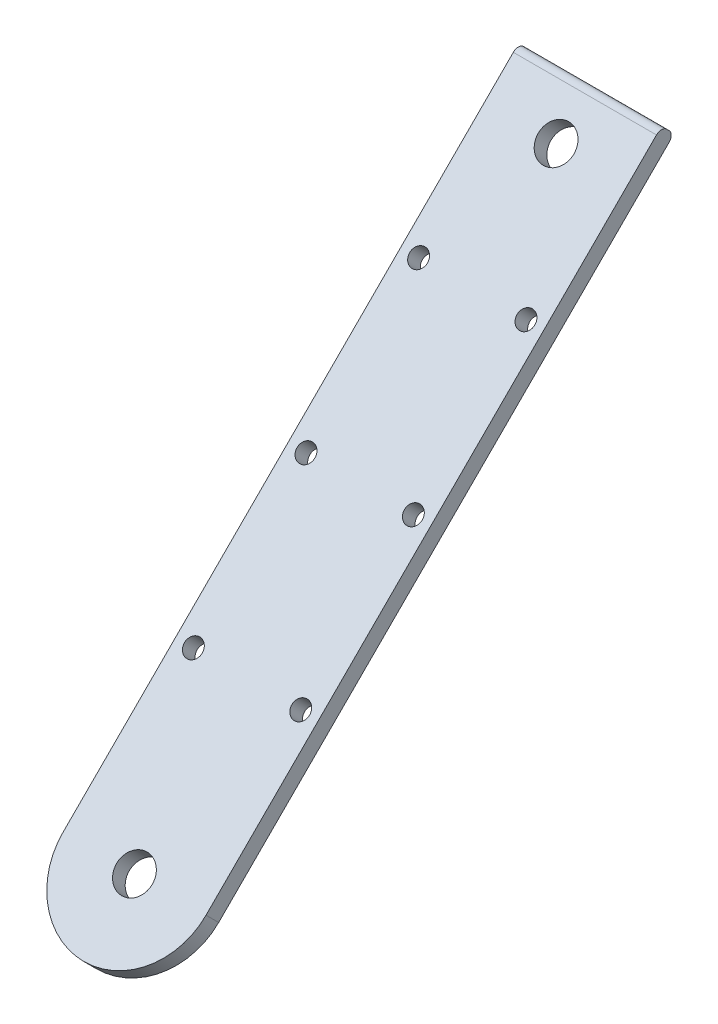
ISO-10303-21;
HEADER;
FILE_DESCRIPTION(('STEP AP214'),'2;1');
FILE_NAME('part.step','',(''),(''),'','','');
FILE_SCHEMA(('AUTOMOTIVE_DESIGN { 1 0 10303 214 1 1 1 1 }'));
ENDSEC;
DATA;
#1=APPLICATION_CONTEXT('core data for automotive mechanical design processes');
#2=APPLICATION_PROTOCOL_DEFINITION('international standard','automotive_design',2000,#1);
#3=PRODUCT_CONTEXT('',#1,'mechanical');
#4=PRODUCT('Part','Part','',(#3));
#5=PRODUCT_RELATED_PRODUCT_CATEGORY('part','',(#4));
#6=PRODUCT_DEFINITION_FORMATION('','',#4);
#7=PRODUCT_DEFINITION_CONTEXT('part definition',#1,'design');
#8=PRODUCT_DEFINITION('design','',#6,#7);
#9=PRODUCT_DEFINITION_SHAPE('','',#8);
#10=(LENGTH_UNIT() NAMED_UNIT(*) SI_UNIT(.MILLI.,.METRE.));
#11=(NAMED_UNIT(*) PLANE_ANGLE_UNIT() SI_UNIT($,.RADIAN.));
#12=(NAMED_UNIT(*) SI_UNIT($,.STERADIAN.) SOLID_ANGLE_UNIT());
#13=UNCERTAINTY_MEASURE_WITH_UNIT(LENGTH_MEASURE(1.E-05),#10,'distance_accuracy_value','');
#14=(GEOMETRIC_REPRESENTATION_CONTEXT(3) GLOBAL_UNCERTAINTY_ASSIGNED_CONTEXT((#13)) GLOBAL_UNIT_ASSIGNED_CONTEXT((#10,
#11,#12)) REPRESENTATION_CONTEXT('',''));
#15=CARTESIAN_POINT('',(0.,0.,0.));
#16=DIRECTION('',(0.,0.,1.));
#17=DIRECTION('',(1.,0.,0.));
#18=AXIS2_PLACEMENT_3D('',#15,#16,#17);
#19=CARTESIAN_POINT('',(40.,125.460804134923,-79.9944564252471));
#20=DIRECTION('',(-1.,0.,0.));
#21=DIRECTION('',(0.,0.,1.));
#22=AXIS2_PLACEMENT_3D('',#19,#20,#21);
#23=CYLINDRICAL_SURFACE('',#22,2.);
#24=CARTESIAN_POINT('',(0.,125.460804134923,-79.9944564252471));
#25=DIRECTION('',(1.,0.,0.));
#26=DIRECTION('',(0.,0.,-1.));
#27=AXIS2_PLACEMENT_3D('',#24,#25,#26);
#28=CIRCLE('',#27,2.);
#29=CARTESIAN_POINT('',(0.,126.875017697296,-81.4086699876202));
#30=VERTEX_POINT('',#29);
#31=CARTESIAN_POINT('',(0.,124.04659057255,-81.4086699876202));
#32=VERTEX_POINT('',#31);
#33=EDGE_CURVE('E107',#30,#32,#28,.F.);
#34=ORIENTED_EDGE('',*,*,#33,.F.);
#35=DIRECTION('',(-1.,0.,0.));
#36=VECTOR('',#35,1.);
#37=CARTESIAN_POINT('',(40.,126.875017697296,-81.4086699876202));
#38=LINE('',#37,#36);
#39=CARTESIAN_POINT('',(40.,126.875017697296,-81.4086699876202));
#40=VERTEX_POINT('',#39);
#41=EDGE_CURVE('E101',#40,#30,#38,.T.);
#42=ORIENTED_EDGE('',*,*,#41,.F.);
#43=CARTESIAN_POINT('',(40.,125.460804134923,-79.9944564252471));
#44=DIRECTION('',(1.,0.,0.));
#45=DIRECTION('',(0.,0.,-1.));
#46=AXIS2_PLACEMENT_3D('',#43,#44,#45);
#47=CIRCLE('',#46,2.);
#48=CARTESIAN_POINT('',(40.,124.04659057255,-81.4086699876202));
#49=VERTEX_POINT('',#48);
#50=EDGE_CURVE('E104',#40,#49,#47,.F.);
#51=ORIENTED_EDGE('',*,*,#50,.T.);
#52=DIRECTION('',(-1.,0.,0.));
#53=VECTOR('',#52,1.);
#54=CARTESIAN_POINT('',(40.,124.04659057255,-81.4086699876202));
#55=LINE('',#54,#53);
#56=EDGE_CURVE('E145',#49,#32,#55,.T.);
#57=ORIENTED_EDGE('',*,*,#56,.T.);
#58=EDGE_LOOP('',(#34,#42,#51,#57));
#59=FACE_BOUND('',#58,.T.);
#60=ADVANCED_FACE('F40',(#59),#23,.T.);
#61=CARTESIAN_POINT('',(40.,104.141843842459,-104.141843842457));
#62=DIRECTION('',(0.,-0.707106781186554,0.707106781186541));
#63=DIRECTION('',(0.,-0.707106781186541,-0.707106781186554));
#64=AXIS2_PLACEMENT_3D('',#61,#62,#63);
#65=PLANE('',#64);
#66=DIRECTION('',(0.,0.707106781186541,0.707106781186554));
#67=VECTOR('',#66,1.);
#68=CARTESIAN_POINT('',(0.,104.141843842459,-104.141843842457));
#69=LINE('',#68,#67);
#70=CARTESIAN_POINT('',(0.,127.579811131654,-80.7038765532618));
#71=VERTEX_POINT('',#70);
#72=EDGE_CURVE('E148',#30,#71,#69,.T.);
#73=ORIENTED_EDGE('',*,*,#72,.T.);
#74=DIRECTION('',(-1.,0.,0.));
#75=VECTOR('',#74,1.);
#76=CARTESIAN_POINT('',(40.,127.579811131654,-80.7038765532618));
#77=LINE('',#76,#75);
#78=CARTESIAN_POINT('',(40.,127.579811131654,-80.7038765532618));
#79=VERTEX_POINT('',#78);
#80=EDGE_CURVE('E112',#79,#71,#77,.T.);
#81=ORIENTED_EDGE('',*,*,#80,.F.);
#82=DIRECTION('',(0.,0.707106781186541,0.707106781186554));
#83=VECTOR('',#82,1.);
#84=CARTESIAN_POINT('',(40.,104.141843842459,-104.141843842457));
#85=LINE('',#84,#83);
#86=EDGE_CURVE('E115',#40,#79,#85,.T.);
#87=ORIENTED_EDGE('',*,*,#86,.F.);
#88=ORIENTED_EDGE('',*,*,#41,.T.);
#89=EDGE_LOOP('',(#73,#81,#87,#88));
#90=FACE_BOUND('',#89,.T.);
#91=ADVANCED_FACE('F116',(#90),#65,.F.);
#92=CARTESIAN_POINT('',(40.,126.165597569281,-79.2896629908887));
#93=DIRECTION('',(-1.,0.,0.));
#94=DIRECTION('',(0.,0.,1.));
#95=AXIS2_PLACEMENT_3D('',#92,#93,#94);
#96=CYLINDRICAL_SURFACE('',#95,1.99999999999998);
#97=CARTESIAN_POINT('',(0.,126.165597569281,-79.2896629908887));
#98=DIRECTION('',(1.,0.,0.));
#99=DIRECTION('',(0.,0.,-1.));
#100=AXIS2_PLACEMENT_3D('',#97,#98,#99);
#101=CIRCLE('',#100,1.99999999999998);
#102=CARTESIAN_POINT('',(0.,127.579811131654,-77.8754494285156));
#103=VERTEX_POINT('',#102);
#104=EDGE_CURVE('E151',#71,#103,#101,.T.);
#105=ORIENTED_EDGE('',*,*,#104,.T.);
#106=DIRECTION('',(-1.,0.,0.));
#107=VECTOR('',#106,1.);
#108=CARTESIAN_POINT('',(40.,127.579811131654,-77.8754494285156));
#109=LINE('',#108,#107);
#110=CARTESIAN_POINT('',(40.,127.579811131654,-77.8754494285156));
#111=VERTEX_POINT('',#110);
#112=EDGE_CURVE('E159',#111,#103,#109,.T.);
#113=ORIENTED_EDGE('',*,*,#112,.F.);
#114=CARTESIAN_POINT('',(40.,126.165597569281,-79.2896629908887));
#115=DIRECTION('',(1.,0.,0.));
#116=DIRECTION('',(0.,0.,-1.));
#117=AXIS2_PLACEMENT_3D('',#114,#115,#116);
#118=CIRCLE('',#117,1.99999999999998);
#119=EDGE_CURVE('E122',#79,#111,#118,.T.);
#120=ORIENTED_EDGE('',*,*,#119,.F.);
#121=ORIENTED_EDGE('',*,*,#80,.T.);
#122=EDGE_LOOP('',(#105,#113,#120,#121));
#123=FACE_BOUND('',#122,.T.);
#124=ADVANCED_FACE('F242',(#123),#96,.T.);
#125=CARTESIAN_POINT('',(40.,24.8521808515692,24.8521808515693));
#126=DIRECTION('',(0.,0.707106781186546,0.707106781186549));
#127=DIRECTION('',(0.,-0.707106781186549,0.707106781186546));
#128=AXIS2_PLACEMENT_3D('',#125,#126,#127);
#129=PLANE('',#128);
#130=CARTESIAN_POINT('',(20.,119.525790268548,-69.8214285654092));
#131=DIRECTION('',(0.,0.707106781186546,0.707106781186549));
#132=DIRECTION('',(0.,-0.707106781186549,0.707106781186546));
#133=AXIS2_PLACEMENT_3D('',#130,#131,#132);
#134=CIRCLE('',#133,5.);
#135=CARTESIAN_POINT('',(20.,115.990256362615,-66.2858946594765));
#136=VERTEX_POINT('',#135);
#137=EDGE_CURVE('E301',#136,#136,#134,.T.);
#138=ORIENTED_EDGE('',*,*,#137,.F.);
#139=EDGE_LOOP('',(#138));
#140=FACE_BOUND('',#139,.T.);
#141=CARTESIAN_POINT('',(20.,1.71480408044884,47.9895576226897));
#142=DIRECTION('',(0.,0.707106781186546,0.707106781186549));
#143=DIRECTION('',(0.,-0.707106781186549,0.707106781186546));
#144=AXIS2_PLACEMENT_3D('',#141,#142,#143);
#145=CIRCLE('',#144,5.);
#146=CARTESIAN_POINT('',(20.,-1.8207298254839,51.5250915286224));
#147=VERTEX_POINT('',#146);
#148=EDGE_CURVE('E186',#147,#147,#145,.T.);
#149=ORIENTED_EDGE('',*,*,#148,.F.);
#150=EDGE_LOOP('',(#149));
#151=FACE_BOUND('',#150,.T.);
#152=CARTESIAN_POINT('',(4.99999999999999,96.1135593688531,-46.4091976657143));
#153=DIRECTION('',(0.,0.707106781186546,0.707106781186549));
#154=DIRECTION('',(0.,0.707106781186549,-0.707106781186546));
#155=AXIS2_PLACEMENT_3D('',#152,#153,#154);
#156=CIRCLE('',#155,2.5);
#157=CARTESIAN_POINT('',(4.99999999999999,97.8813263218194,-48.1769646186806));
#158=VERTEX_POINT('',#157);
#159=EDGE_CURVE('E308',#158,#158,#156,.T.);
#160=ORIENTED_EDGE('',*,*,#159,.F.);
#161=EDGE_LOOP('',(#160));
#162=FACE_BOUND('',#161,.T.);
#163=CARTESIAN_POINT('',(4.99999999999999,64.6473076060517,-14.942945902913));
#164=DIRECTION('',(0.,0.707106781186546,0.707106781186549));
#165=DIRECTION('',(0.,0.707106781186549,-0.707106781186546));
#166=AXIS2_PLACEMENT_3D('',#163,#164,#165);
#167=CIRCLE('',#166,2.5);
#168=CARTESIAN_POINT('',(4.99999999999999,66.415074559018,-16.7107128558793));
#169=VERTEX_POINT('',#168);
#170=EDGE_CURVE('E315',#169,#169,#167,.T.);
#171=ORIENTED_EDGE('',*,*,#170,.F.);
#172=EDGE_LOOP('',(#171));
#173=FACE_BOUND('',#172,.T.);
#174=CARTESIAN_POINT('',(4.99999999999999,33.1810558432502,16.5233058598884));
#175=DIRECTION('',(0.,0.707106781186546,0.707106781186549));
#176=DIRECTION('',(0.,0.707106781186549,-0.707106781186546));
#177=AXIS2_PLACEMENT_3D('',#174,#175,#176);
#178=CIRCLE('',#177,2.5);
#179=CARTESIAN_POINT('',(4.99999999999999,34.9488227962166,14.755538906922));
#180=VERTEX_POINT('',#179);
#181=EDGE_CURVE('E135',#180,#180,#178,.T.);
#182=ORIENTED_EDGE('',*,*,#181,.F.);
#183=EDGE_LOOP('',(#182));
#184=FACE_BOUND('',#183,.T.);
#185=CARTESIAN_POINT('',(35.,33.1810558432502,16.5233058598884));
#186=DIRECTION('',(0.,0.707106781186546,0.707106781186549));
#187=DIRECTION('',(0.,-0.707106781186549,0.707106781186546));
#188=AXIS2_PLACEMENT_3D('',#185,#186,#187);
#189=CIRCLE('',#188,2.5);
#190=CARTESIAN_POINT('',(35.,31.4132888902839,18.2910728128547));
#191=VERTEX_POINT('',#190);
#192=EDGE_CURVE('E328',#191,#191,#189,.T.);
#193=ORIENTED_EDGE('',*,*,#192,.F.);
#194=EDGE_LOOP('',(#193));
#195=FACE_BOUND('',#194,.T.);
#196=CARTESIAN_POINT('',(35.,64.6473076060517,-14.942945902913));
#197=DIRECTION('',(0.,0.707106781186546,0.707106781186549));
#198=DIRECTION('',(0.,-0.707106781186549,0.707106781186546));
#199=AXIS2_PLACEMENT_3D('',#196,#197,#198);
#200=CIRCLE('',#199,2.5);
#201=CARTESIAN_POINT('',(35.,62.8795406530853,-13.1751789499466));
#202=VERTEX_POINT('',#201);
#203=EDGE_CURVE('E325',#202,#202,#200,.T.);
#204=ORIENTED_EDGE('',*,*,#203,.F.);
#205=EDGE_LOOP('',(#204));
#206=FACE_BOUND('',#205,.T.);
#207=CARTESIAN_POINT('',(35.,96.1135593688531,-46.4091976657143));
#208=DIRECTION('',(0.,0.707106781186546,0.707106781186549));
#209=DIRECTION('',(0.,-0.707106781186549,0.707106781186546));
#210=AXIS2_PLACEMENT_3D('',#207,#208,#209);
#211=CIRCLE('',#210,2.5);
#212=CARTESIAN_POINT('',(35.,94.3457924158867,-44.6414307127479));
#213=VERTEX_POINT('',#212);
#214=EDGE_CURVE('E314',#213,#213,#211,.T.);
#215=ORIENTED_EDGE('',*,*,#214,.F.);
#216=EDGE_LOOP('',(#215));
#217=FACE_BOUND('',#216,.T.);
#218=DIRECTION('',(0.,0.707106781186549,-0.707106781186546));
#219=VECTOR('',#218,1.);
#220=CARTESIAN_POINT('',(0.,24.8521808515692,24.8521808515693));
#221=LINE('',#220,#219);
#222=CARTESIAN_POINT('',(0.,1.71480408044882,47.9895576226897));
#223=VERTEX_POINT('',#222);
#224=EDGE_CURVE('E132',#223,#103,#221,.T.);
#225=ORIENTED_EDGE('',*,*,#224,.F.);
#226=CARTESIAN_POINT('',(20.,1.71480408044883,47.9895576226897));
#227=DIRECTION('',(0.,0.707106781186546,0.707106781186549));
#228=DIRECTION('',(0.,-0.707106781186549,0.707106781186546));
#229=AXIS2_PLACEMENT_3D('',#226,#227,#228);
#230=CIRCLE('',#229,20.);
#231=CARTESIAN_POINT('',(20.,-12.4273315432822,62.1316932464206));
#232=VERTEX_POINT('',#231);
#233=EDGE_CURVE('E50',#223,#232,#230,.T.);
#234=ORIENTED_EDGE('',*,*,#233,.T.);
#235=CARTESIAN_POINT('',(20.,1.71480408044882,47.9895576226897));
#236=DIRECTION('',(0.,0.707106781186546,0.707106781186549));
#237=DIRECTION('',(0.,-0.707106781186549,0.707106781186546));
#238=AXIS2_PLACEMENT_3D('',#235,#236,#237);
#239=CIRCLE('',#238,20.);
#240=CARTESIAN_POINT('',(40.,1.71480408044882,47.9895576226897));
#241=VERTEX_POINT('',#240);
#242=EDGE_CURVE('E167',#232,#241,#239,.T.);
#243=ORIENTED_EDGE('',*,*,#242,.T.);
#244=DIRECTION('',(0.,0.707106781186549,-0.707106781186546));
#245=VECTOR('',#244,1.);
#246=CARTESIAN_POINT('',(40.,24.8521808515692,24.8521808515693));
#247=LINE('',#246,#245);
#248=EDGE_CURVE('E140',#241,#111,#247,.T.);
#249=ORIENTED_EDGE('',*,*,#248,.T.);
#250=ORIENTED_EDGE('',*,*,#112,.T.);
#251=EDGE_LOOP('',(#225,#234,#243,#249,#250));
#252=FACE_BOUND('',#251,.T.);
#253=ADVANCED_FACE('F216',(#140,#151,#162,#173,#184,#195,#206,#217,#252),#129,.T.);
#254=CARTESIAN_POINT('',(40.,21.3189602924649,21.3189602924652));
#255=DIRECTION('',(0.,-0.707106781186543,-0.707106781186552));
#256=DIRECTION('',(0.,0.707106781186552,-0.707106781186543));
#257=AXIS2_PLACEMENT_3D('',#254,#255,#256);
#258=PLANE('',#257);
#259=CARTESIAN_POINT('',(20.,115.992569709444,-73.354649124513));
#260=DIRECTION('',(0.,-0.707106781186543,-0.707106781186552));
#261=DIRECTION('',(0.,0.707106781186552,-0.707106781186543));
#262=AXIS2_PLACEMENT_3D('',#259,#260,#261);
#263=CIRCLE('',#262,5.);
#264=CARTESIAN_POINT('',(20.,119.528103615377,-76.8901830304457));
#265=VERTEX_POINT('',#264);
#266=EDGE_CURVE('E304',#265,#265,#263,.T.);
#267=ORIENTED_EDGE('',*,*,#266,.F.);
#268=EDGE_LOOP('',(#267));
#269=FACE_BOUND('',#268,.T.);
#270=CARTESIAN_POINT('',(20.,-1.81841647865548,44.4563370635853));
#271=DIRECTION('',(0.,-0.707106781186543,-0.707106781186552));
#272=DIRECTION('',(0.,0.707106781186552,-0.707106781186543));
#273=AXIS2_PLACEMENT_3D('',#270,#271,#272);
#274=CIRCLE('',#273,5.);
#275=CARTESIAN_POINT('',(20.,1.71711742727728,40.9208031576526));
#276=VERTEX_POINT('',#275);
#277=EDGE_CURVE('E44',#276,#276,#274,.T.);
#278=ORIENTED_EDGE('',*,*,#277,.F.);
#279=EDGE_LOOP('',(#278));
#280=FACE_BOUND('',#279,.T.);
#281=CARTESIAN_POINT('',(4.99999999999999,92.5803388097492,-49.9424182248182));
#282=DIRECTION('',(0.,-0.707106781186543,-0.707106781186552));
#283=DIRECTION('',(0.,0.707106781186552,-0.707106781186543));
#284=AXIS2_PLACEMENT_3D('',#281,#282,#283);
#285=CIRCLE('',#284,2.5);
#286=CARTESIAN_POINT('',(4.99999999999999,94.3481057627155,-51.7101851777845));
#287=VERTEX_POINT('',#286);
#288=EDGE_CURVE('E201',#287,#287,#285,.T.);
#289=ORIENTED_EDGE('',*,*,#288,.F.);
#290=EDGE_LOOP('',(#289));
#291=FACE_BOUND('',#290,.T.);
#292=CARTESIAN_POINT('',(4.99999999999999,61.1140870469476,-18.476166462017));
#293=DIRECTION('',(0.,-0.707106781186543,-0.707106781186552));
#294=DIRECTION('',(0.,0.707106781186552,-0.707106781186543));
#295=AXIS2_PLACEMENT_3D('',#292,#293,#294);
#296=CIRCLE('',#295,2.5);
#297=CARTESIAN_POINT('',(4.99999999999999,62.881853999914,-20.2439334149834));
#298=VERTEX_POINT('',#297);
#299=EDGE_CURVE('E198',#298,#298,#296,.T.);
#300=ORIENTED_EDGE('',*,*,#299,.F.);
#301=EDGE_LOOP('',(#300));
#302=FACE_BOUND('',#301,.T.);
#303=CARTESIAN_POINT('',(4.99999999999999,29.6478352841461,12.9900853007842));
#304=DIRECTION('',(0.,-0.707106781186543,-0.707106781186552));
#305=DIRECTION('',(0.,0.707106781186552,-0.707106781186543));
#306=AXIS2_PLACEMENT_3D('',#303,#304,#305);
#307=CIRCLE('',#306,2.5);
#308=CARTESIAN_POINT('',(4.99999999999999,31.4156022371125,11.2223183478178));
#309=VERTEX_POINT('',#308);
#310=EDGE_CURVE('E194',#309,#309,#307,.T.);
#311=ORIENTED_EDGE('',*,*,#310,.F.);
#312=EDGE_LOOP('',(#311));
#313=FACE_BOUND('',#312,.T.);
#314=CARTESIAN_POINT('',(35.,29.6478352841461,12.9900853007842));
#315=DIRECTION('',(0.,-0.707106781186543,-0.707106781186552));
#316=DIRECTION('',(0.,0.707106781186552,-0.707106781186543));
#317=AXIS2_PLACEMENT_3D('',#314,#315,#316);
#318=CIRCLE('',#317,2.5);
#319=CARTESIAN_POINT('',(35.,31.4156022371125,11.2223183478178));
#320=VERTEX_POINT('',#319);
#321=EDGE_CURVE('E190',#320,#320,#318,.T.);
#322=ORIENTED_EDGE('',*,*,#321,.F.);
#323=EDGE_LOOP('',(#322));
#324=FACE_BOUND('',#323,.T.);
#325=CARTESIAN_POINT('',(35.,61.1140870469476,-18.476166462017));
#326=DIRECTION('',(0.,-0.707106781186543,-0.707106781186552));
#327=DIRECTION('',(0.,0.707106781186552,-0.707106781186543));
#328=AXIS2_PLACEMENT_3D('',#325,#326,#327);
#329=CIRCLE('',#328,2.5);
#330=CARTESIAN_POINT('',(35.,62.881853999914,-20.2439334149834));
#331=VERTEX_POINT('',#330);
#332=EDGE_CURVE('E185',#331,#331,#329,.T.);
#333=ORIENTED_EDGE('',*,*,#332,.F.);
#334=EDGE_LOOP('',(#333));
#335=FACE_BOUND('',#334,.T.);
#336=CARTESIAN_POINT('',(35.,92.5803388097492,-49.9424182248182));
#337=DIRECTION('',(0.,-0.707106781186543,-0.707106781186552));
#338=DIRECTION('',(0.,0.707106781186552,-0.707106781186543));
#339=AXIS2_PLACEMENT_3D('',#336,#337,#338);
#340=CIRCLE('',#339,2.5);
#341=CARTESIAN_POINT('',(35.,94.3481057627155,-51.7101851777845));
#342=VERTEX_POINT('',#341);
#343=EDGE_CURVE('E181',#342,#342,#340,.T.);
#344=ORIENTED_EDGE('',*,*,#343,.F.);
#345=EDGE_LOOP('',(#344));
#346=FACE_BOUND('',#345,.T.);
#347=CARTESIAN_POINT('',(20.,-1.81841647865547,44.4563370635853));
#348=DIRECTION('',(0.,-0.707106781186543,-0.707106781186552));
#349=DIRECTION('',(0.,0.707106781186552,-0.707106781186543));
#350=AXIS2_PLACEMENT_3D('',#347,#348,#349);
#351=CIRCLE('',#350,20.);
#352=CARTESIAN_POINT('',(40.,-1.81841647865547,44.4563370635853));
#353=VERTEX_POINT('',#352);
#354=CARTESIAN_POINT('',(20.,-15.9605521023865,58.5984726873162));
#355=VERTEX_POINT('',#354);
#356=EDGE_CURVE('E173',#353,#355,#351,.T.);
#357=ORIENTED_EDGE('',*,*,#356,.T.);
#358=CARTESIAN_POINT('',(20.,-1.81841647865546,44.4563370635853));
#359=DIRECTION('',(0.,-0.707106781186543,-0.707106781186552));
#360=DIRECTION('',(0.,0.707106781186552,-0.707106781186543));
#361=AXIS2_PLACEMENT_3D('',#358,#359,#360);
#362=CIRCLE('',#361,20.);
#363=CARTESIAN_POINT('',(0.,-1.81841647865546,44.4563370635853));
#364=VERTEX_POINT('',#363);
#365=EDGE_CURVE('E11',#355,#364,#362,.T.);
#366=ORIENTED_EDGE('',*,*,#365,.T.);
#367=DIRECTION('',(0.,-0.707106781186552,0.707106781186543));
#368=VECTOR('',#367,1.);
#369=CARTESIAN_POINT('',(0.,21.3189602924649,21.3189602924652));
#370=LINE('',#369,#368);
#371=EDGE_CURVE('E129',#32,#364,#370,.T.);
#372=ORIENTED_EDGE('',*,*,#371,.F.);
#373=ORIENTED_EDGE('',*,*,#56,.F.);
#374=DIRECTION('',(0.,-0.707106781186552,0.707106781186543));
#375=VECTOR('',#374,1.);
#376=CARTESIAN_POINT('',(40.,21.3189602924649,21.3189602924652));
#377=LINE('',#376,#375);
#378=EDGE_CURVE('E127',#49,#353,#377,.T.);
#379=ORIENTED_EDGE('',*,*,#378,.T.);
#380=EDGE_LOOP('',(#357,#366,#372,#373,#379));
#381=FACE_BOUND('',#380,.T.);
#382=ADVANCED_FACE('F213',(#269,#280,#291,#302,#313,#324,#335,#346,#381),#258,.T.);
#383=CARTESIAN_POINT('',(40.,0.,0.));
#384=DIRECTION('',(1.,0.,0.));
#385=DIRECTION('',(0.,0.,-1.));
#386=AXIS2_PLACEMENT_3D('',#383,#384,#385);
#387=PLANE('',#386);
#388=ORIENTED_EDGE('',*,*,#248,.F.);
#389=DIRECTION('',(0.,0.707106781186544,0.707106781186551));
#390=VECTOR('',#389,1.);
#391=CARTESIAN_POINT('',(40.,-23.1373767711204,23.1373767711202));
#392=LINE('',#391,#390);
#393=EDGE_CURVE('E170',#241,#353,#392,.F.);
#394=ORIENTED_EDGE('',*,*,#393,.T.);
#395=ORIENTED_EDGE('',*,*,#378,.F.);
#396=ORIENTED_EDGE('',*,*,#50,.F.);
#397=ORIENTED_EDGE('',*,*,#86,.T.);
#398=ORIENTED_EDGE('',*,*,#119,.T.);
#399=EDGE_LOOP('',(#388,#394,#395,#396,#397,#398));
#400=FACE_BOUND('',#399,.T.);
#401=ADVANCED_FACE('F125',(#400),#387,.T.);
#402=CARTESIAN_POINT('',(0.,0.,0.));
#403=DIRECTION('',(1.,0.,0.));
#404=DIRECTION('',(0.,0.,-1.));
#405=AXIS2_PLACEMENT_3D('',#402,#403,#404);
#406=PLANE('',#405);
#407=ORIENTED_EDGE('',*,*,#371,.T.);
#408=DIRECTION('',(0.,0.707106781186544,0.707106781186551));
#409=VECTOR('',#408,1.);
#410=CARTESIAN_POINT('',(0.,1.71480408044886,47.9895576226897));
#411=LINE('',#410,#409);
#412=EDGE_CURVE('E176',#364,#223,#411,.T.);
#413=ORIENTED_EDGE('',*,*,#412,.T.);
#414=ORIENTED_EDGE('',*,*,#224,.T.);
#415=ORIENTED_EDGE('',*,*,#104,.F.);
#416=ORIENTED_EDGE('',*,*,#72,.F.);
#417=ORIENTED_EDGE('',*,*,#33,.T.);
#418=EDGE_LOOP('',(#407,#413,#414,#415,#416,#417));
#419=FACE_BOUND('',#418,.T.);
#420=ADVANCED_FACE('F237',(#419),#406,.F.);
#421=CARTESIAN_POINT('',(20.,-23.1373767711204,23.1373767711202));
#422=DIRECTION('',(0.,0.707106781186544,0.707106781186551));
#423=DIRECTION('',(0.,-0.707106781186551,0.707106781186544));
#424=AXIS2_PLACEMENT_3D('',#421,#422,#423);
#425=CYLINDRICAL_SURFACE('',#424,20.);
#426=ORIENTED_EDGE('',*,*,#356,.F.);
#427=ORIENTED_EDGE('',*,*,#393,.F.);
#428=ORIENTED_EDGE('',*,*,#242,.F.);
#429=DIRECTION('',(0.,0.707106781186544,0.707106781186551));
#430=VECTOR('',#429,1.);
#431=CARTESIAN_POINT('',(20.,-37.2795123948514,37.279512394851));
#432=LINE('',#431,#430);
#433=EDGE_CURVE('E111',#355,#232,#432,.T.);
#434=ORIENTED_EDGE('',*,*,#433,.F.);
#435=EDGE_LOOP('',(#426,#427,#428,#434));
#436=FACE_BOUND('',#435,.T.);
#437=ADVANCED_FACE('F234',(#436),#425,.T.);
#438=CARTESIAN_POINT('',(20.,-23.1373767711204,23.1373767711202));
#439=DIRECTION('',(0.,-0.707106781186544,-0.707106781186551));
#440=DIRECTION('',(0.,0.707106781186551,-0.707106781186544));
#441=AXIS2_PLACEMENT_3D('',#438,#439,#440);
#442=CYLINDRICAL_SURFACE('',#441,20.);
#443=ORIENTED_EDGE('',*,*,#365,.F.);
#444=ORIENTED_EDGE('',*,*,#433,.T.);
#445=ORIENTED_EDGE('',*,*,#233,.F.);
#446=ORIENTED_EDGE('',*,*,#412,.F.);
#447=EDGE_LOOP('',(#443,#444,#445,#446));
#448=FACE_BOUND('',#447,.T.);
#449=ADVANCED_FACE('F42',(#448),#442,.T.);
#450=CARTESIAN_POINT('',(35.,92.5780254629203,-49.944731571647));
#451=DIRECTION('',(0.,0.707106781186546,0.707106781186549));
#452=DIRECTION('',(0.,-0.707106781186549,0.707106781186546));
#453=AXIS2_PLACEMENT_3D('',#450,#451,#452);
#454=CYLINDRICAL_SURFACE('',#453,2.5);
#455=ORIENTED_EDGE('',*,*,#343,.T.);
#456=EDGE_LOOP('',(#455));
#457=FACE_BOUND('',#456,.T.);
#458=ORIENTED_EDGE('',*,*,#214,.T.);
#459=EDGE_LOOP('',(#458));
#460=FACE_BOUND('',#459,.T.);
#461=ADVANCED_FACE('F262',(#457,#460),#454,.F.);
#462=CARTESIAN_POINT('',(35.,61.1117737001189,-18.4784798088457));
#463=DIRECTION('',(0.,0.707106781186546,0.707106781186549));
#464=DIRECTION('',(0.,-0.707106781186549,0.707106781186546));
#465=AXIS2_PLACEMENT_3D('',#462,#463,#464);
#466=CYLINDRICAL_SURFACE('',#465,2.5);
#467=ORIENTED_EDGE('',*,*,#332,.T.);
#468=EDGE_LOOP('',(#467));
#469=FACE_BOUND('',#468,.T.);
#470=ORIENTED_EDGE('',*,*,#203,.T.);
#471=EDGE_LOOP('',(#470));
#472=FACE_BOUND('',#471,.T.);
#473=ADVANCED_FACE('F277',(#469,#472),#466,.F.);
#474=CARTESIAN_POINT('',(35.,29.6455219373175,12.9877719539556));
#475=DIRECTION('',(0.,0.707106781186546,0.707106781186549));
#476=DIRECTION('',(0.,-0.707106781186549,0.707106781186546));
#477=AXIS2_PLACEMENT_3D('',#474,#475,#476);
#478=CYLINDRICAL_SURFACE('',#477,2.5);
#479=ORIENTED_EDGE('',*,*,#321,.T.);
#480=EDGE_LOOP('',(#479));
#481=FACE_BOUND('',#480,.T.);
#482=ORIENTED_EDGE('',*,*,#192,.T.);
#483=EDGE_LOOP('',(#482));
#484=FACE_BOUND('',#483,.T.);
#485=ADVANCED_FACE('F273',(#481,#484),#478,.F.);
#486=CARTESIAN_POINT('',(4.99999999999999,29.6455219373175,12.9877719539556));
#487=DIRECTION('',(0.,0.707106781186546,0.707106781186549));
#488=DIRECTION('',(0.,-0.707106781186549,0.707106781186546));
#489=AXIS2_PLACEMENT_3D('',#486,#487,#488);
#490=CYLINDRICAL_SURFACE('',#489,2.5);
#491=ORIENTED_EDGE('',*,*,#310,.T.);
#492=EDGE_LOOP('',(#491));
#493=FACE_BOUND('',#492,.T.);
#494=ORIENTED_EDGE('',*,*,#181,.T.);
#495=EDGE_LOOP('',(#494));
#496=FACE_BOUND('',#495,.T.);
#497=ADVANCED_FACE('F269',(#493,#496),#490,.F.);
#498=CARTESIAN_POINT('',(4.99999999999999,61.1117737001189,-18.4784798088457));
#499=DIRECTION('',(0.,0.707106781186546,0.707106781186549));
#500=DIRECTION('',(0.,-0.707106781186549,0.707106781186546));
#501=AXIS2_PLACEMENT_3D('',#498,#499,#500);
#502=CYLINDRICAL_SURFACE('',#501,2.5);
#503=ORIENTED_EDGE('',*,*,#299,.T.);
#504=EDGE_LOOP('',(#503));
#505=FACE_BOUND('',#504,.T.);
#506=ORIENTED_EDGE('',*,*,#170,.T.);
#507=EDGE_LOOP('',(#506));
#508=FACE_BOUND('',#507,.T.);
#509=ADVANCED_FACE('F272',(#505,#508),#502,.F.);
#510=CARTESIAN_POINT('',(4.99999999999999,92.5780254629203,-49.944731571647));
#511=DIRECTION('',(0.,0.707106781186546,0.707106781186549));
#512=DIRECTION('',(0.,-0.707106781186549,0.707106781186546));
#513=AXIS2_PLACEMENT_3D('',#510,#511,#512);
#514=CYLINDRICAL_SURFACE('',#513,2.5);
#515=ORIENTED_EDGE('',*,*,#288,.T.);
#516=EDGE_LOOP('',(#515));
#517=FACE_BOUND('',#516,.T.);
#518=ORIENTED_EDGE('',*,*,#159,.T.);
#519=EDGE_LOOP('',(#518));
#520=FACE_BOUND('',#519,.T.);
#521=ADVANCED_FACE('F285',(#517,#520),#514,.F.);
#522=CARTESIAN_POINT('',(20.,-1.82072982548389,44.4540237167569));
#523=DIRECTION('',(0.,0.707106781186546,0.707106781186549));
#524=DIRECTION('',(0.,-0.707106781186549,0.707106781186546));
#525=AXIS2_PLACEMENT_3D('',#522,#523,#524);
#526=CYLINDRICAL_SURFACE('',#525,5.);
#527=ORIENTED_EDGE('',*,*,#277,.T.);
#528=EDGE_LOOP('',(#527));
#529=FACE_BOUND('',#528,.T.);
#530=ORIENTED_EDGE('',*,*,#148,.T.);
#531=EDGE_LOOP('',(#530));
#532=FACE_BOUND('',#531,.T.);
#533=ADVANCED_FACE('F210',(#529,#532),#526,.F.);
#534=CARTESIAN_POINT('',(20.,119.528103615377,-69.8191152185803));
#535=DIRECTION('',(0.,-0.707106781186543,-0.707106781186552));
#536=DIRECTION('',(0.,0.707106781186552,-0.707106781186543));
#537=AXIS2_PLACEMENT_3D('',#534,#535,#536);
#538=CYLINDRICAL_SURFACE('',#537,5.);
#539=ORIENTED_EDGE('',*,*,#137,.T.);
#540=EDGE_LOOP('',(#539));
#541=FACE_BOUND('',#540,.T.);
#542=ORIENTED_EDGE('',*,*,#266,.T.);
#543=EDGE_LOOP('',(#542));
#544=FACE_BOUND('',#543,.T.);
#545=ADVANCED_FACE('F293',(#541,#544),#538,.F.);
#546=CLOSED_SHELL('',(#60,#91,#124,#253,#382,#401,#420,#437,#449,#461,#473,#485,#497,#509,#521,
#533,#545));
#547=MANIFOLD_SOLID_BREP('B2',#546);
#548=ADVANCED_BREP_SHAPE_REPRESENTATION('',(#18,#547),#14);
#549=SHAPE_DEFINITION_REPRESENTATION(#9,#548);
ENDSEC;
END-ISO-10303-21;
